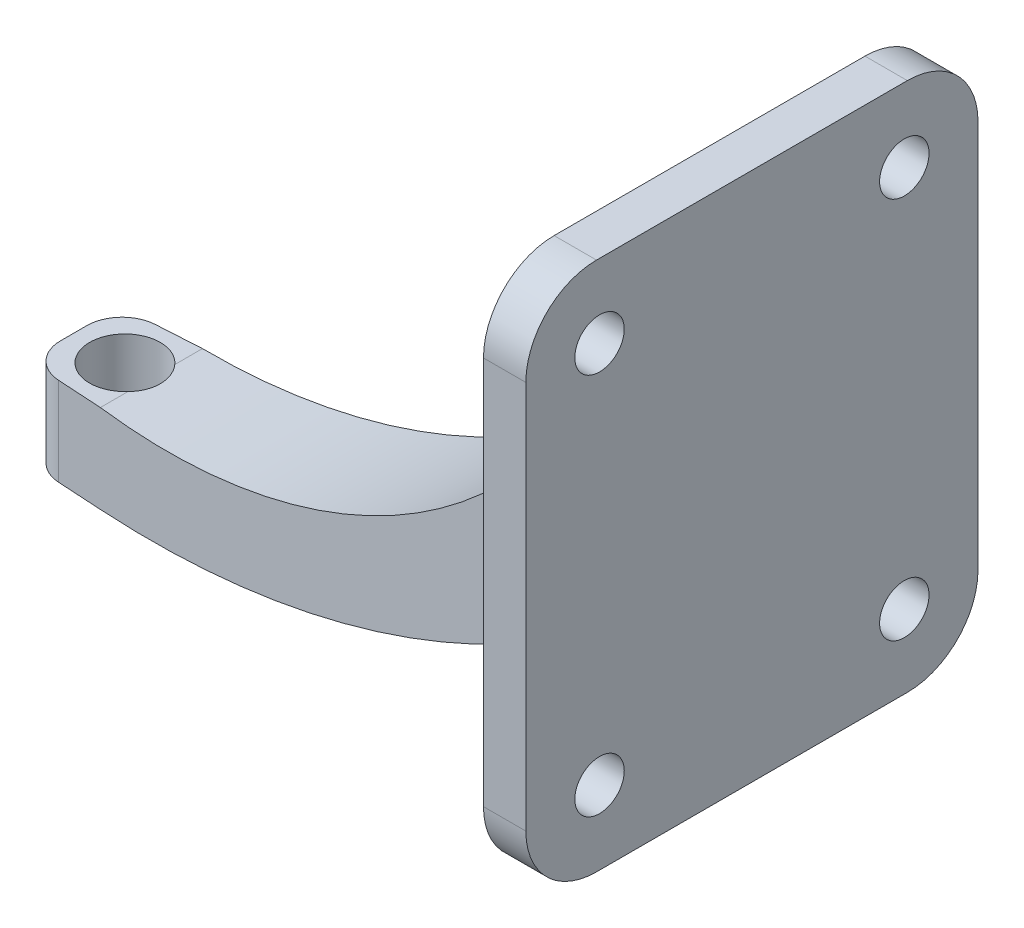
ISO-10303-21;
HEADER;
FILE_DESCRIPTION(('STEP AP214'),'2;1');
FILE_NAME('part.step','',(''),(''),'','','');
FILE_SCHEMA(('AUTOMOTIVE_DESIGN { 1 0 10303 214 1 1 1 1 }'));
ENDSEC;
DATA;
#1=APPLICATION_CONTEXT('core data for automotive mechanical design processes');
#2=APPLICATION_PROTOCOL_DEFINITION('international standard','automotive_design',2000,#1);
#3=PRODUCT_CONTEXT('',#1,'mechanical');
#4=PRODUCT('Part','Part','',(#3));
#5=PRODUCT_RELATED_PRODUCT_CATEGORY('part','',(#4));
#6=PRODUCT_DEFINITION_FORMATION('','',#4);
#7=PRODUCT_DEFINITION_CONTEXT('part definition',#1,'design');
#8=PRODUCT_DEFINITION('design','',#6,#7);
#9=PRODUCT_DEFINITION_SHAPE('','',#8);
#10=(LENGTH_UNIT() NAMED_UNIT(*) SI_UNIT(.MILLI.,.METRE.));
#11=(NAMED_UNIT(*) PLANE_ANGLE_UNIT() SI_UNIT($,.RADIAN.));
#12=(NAMED_UNIT(*) SI_UNIT($,.STERADIAN.) SOLID_ANGLE_UNIT());
#13=UNCERTAINTY_MEASURE_WITH_UNIT(LENGTH_MEASURE(1.E-05),#10,'distance_accuracy_value','');
#14=(GEOMETRIC_REPRESENTATION_CONTEXT(3) GLOBAL_UNCERTAINTY_ASSIGNED_CONTEXT((#13)) GLOBAL_UNIT_ASSIGNED_CONTEXT((#10,
#11,#12)) REPRESENTATION_CONTEXT('',''));
#15=CARTESIAN_POINT('',(0.,0.,0.));
#16=DIRECTION('',(0.,0.,1.));
#17=DIRECTION('',(1.,0.,0.));
#18=AXIS2_PLACEMENT_3D('',#15,#16,#17);
#19=CARTESIAN_POINT('',(22.,0.,48.));
#20=DIRECTION('',(0.,1.,0.));
#21=DIRECTION('',(-1.,0.,0.));
#22=AXIS2_PLACEMENT_3D('',#19,#20,#21);
#23=PLANE('',#22);
#24=DIRECTION('',(0.,0.,-1.));
#25=VECTOR('',#24,1.);
#26=CARTESIAN_POINT('',(21.9999999999999,0.,48.));
#27=LINE('',#26,#25);
#28=CARTESIAN_POINT('',(21.9999999999999,0.,17.3856217223384));
#29=VERTEX_POINT('',#28);
#30=CARTESIAN_POINT('',(22.,0.,9.55113868092659));
#31=VERTEX_POINT('',#30);
#32=EDGE_CURVE('E181',#29,#31,#27,.T.);
#33=ORIENTED_EDGE('',*,*,#32,.F.);
#34=CARTESIAN_POINT('',(14.5,0.,24.));
#35=DIRECTION('',(0.,1.,0.));
#36=DIRECTION('',(-1.,0.,0.));
#37=AXIS2_PLACEMENT_3D('',#34,#35,#36);
#38=CIRCLE('',#37,10.);
#39=CARTESIAN_POINT('',(22.,0.,30.6143782776615));
#40=VERTEX_POINT('',#39);
#41=EDGE_CURVE('E46',#29,#40,#38,.T.);
#42=ORIENTED_EDGE('',*,*,#41,.T.);
#43=CARTESIAN_POINT('',(22.,0.,38.4488613190734));
#44=VERTEX_POINT('',#43);
#45=EDGE_CURVE('E182',#44,#40,#27,.T.);
#46=ORIENTED_EDGE('',*,*,#45,.F.);
#47=DIRECTION('',(-0.998177876280131,0.,-0.06034009699104));
#48=VECTOR('',#47,1.);
#49=CARTESIAN_POINT('',(180.,0.,48.));
#50=LINE('',#49,#48);
#51=CARTESIAN_POINT('',(9.39659903008967,0.,37.6869826449282));
#52=VERTEX_POINT('',#51);
#53=EDGE_CURVE('E588',#44,#52,#50,.T.);
#54=ORIENTED_EDGE('',*,*,#53,.T.);
#55=CARTESIAN_POINT('',(10.,0.,27.7052038821269));
#56=DIRECTION('',(0.,-1.,0.));
#57=DIRECTION('',(0.,0.,-1.));
#58=AXIS2_PLACEMENT_3D('',#55,#56,#57);
#59=CIRCLE('',#58,10.);
#60=CARTESIAN_POINT('',(0.,0.,27.7052038821269));
#61=VERTEX_POINT('',#60);
#62=EDGE_CURVE('E602',#52,#61,#59,.T.);
#63=ORIENTED_EDGE('',*,*,#62,.T.);
#64=DIRECTION('',(0.,0.,-1.));
#65=VECTOR('',#64,1.);
#66=CARTESIAN_POINT('',(0.,0.,48.));
#67=LINE('',#66,#65);
#68=CARTESIAN_POINT('',(0.,0.,20.2947961178731));
#69=VERTEX_POINT('',#68);
#70=EDGE_CURVE('E266',#61,#69,#67,.T.);
#71=ORIENTED_EDGE('',*,*,#70,.T.);
#72=CARTESIAN_POINT('',(10.,0.,20.2947961178731));
#73=DIRECTION('',(0.,1.,0.));
#74=DIRECTION('',(0.,0.,1.));
#75=AXIS2_PLACEMENT_3D('',#72,#73,#74);
#76=CIRCLE('',#75,10.);
#77=CARTESIAN_POINT('',(9.39659903008966,0.,10.3130173550718));
#78=VERTEX_POINT('',#77);
#79=EDGE_CURVE('E604',#78,#69,#76,.T.);
#80=ORIENTED_EDGE('',*,*,#79,.F.);
#81=DIRECTION('',(-0.998177876280131,0.,0.06034009699104));
#82=VECTOR('',#81,1.);
#83=CARTESIAN_POINT('',(0.65536691487986,0.,10.8414269764296));
#84=LINE('',#83,#82);
#85=EDGE_CURVE('E611',#31,#78,#84,.T.);
#86=ORIENTED_EDGE('',*,*,#85,.F.);
#87=EDGE_LOOP('',(#33,#42,#46,#54,#63,#71,#80,#86));
#88=FACE_BOUND('',#87,.T.);
#89=ADVANCED_FACE('F32',(#88),#23,.F.);
#90=CARTESIAN_POINT('',(22.,250.800841383973,48.));
#91=DIRECTION('',(0.,0.,-1.));
#92=DIRECTION('',(-1.,0.,0.));
#93=AXIS2_PLACEMENT_3D('',#90,#91,#92);
#94=CYLINDRICAL_SURFACE('',#93,250.800841383973);
#95=ORIENTED_EDGE('',*,*,#45,.T.);
#96=CARTESIAN_POINT('',(22.,0.,30.6143782776615));
#97=CARTESIAN_POINT('',(22.186050208909,6.50438569303494E-07,30.403462890707));
#98=CARTESIAN_POINT('',(22.3631542831169,0.000207121473940263,30.1846637562066));
#99=CARTESIAN_POINT('',(22.6983088353976,0.000915985913102646,29.7329451696042));
#100=CARTESIAN_POINT('',(22.8563602372151,0.0014183649632125,29.5000264028983));
#101=CARTESIAN_POINT('',(23.1521655513058,0.00260294530021276,29.0218579567898));
#102=CARTESIAN_POINT('',(23.2899332240548,0.00328502379465494,28.7766167898009));
#103=CARTESIAN_POINT('',(23.5443271556839,0.00472242142916432,28.2754082161284));
#104=CARTESIAN_POINT('',(23.6609536685541,0.00547773968916116,28.0194409383538));
#105=CARTESIAN_POINT('',(23.8722881388576,0.00696634985879363,27.4984675560009));
#106=CARTESIAN_POINT('',(23.966985432651,0.007699630902084,27.2334571255245));
#107=CARTESIAN_POINT('',(24.133717752448,0.00906272072908062,26.6963942920705));
#108=CARTESIAN_POINT('',(24.2057523009994,0.0096925273326832,26.4243417408622));
#109=CARTESIAN_POINT('',(24.3266271850861,0.010784759559879,25.8752107495151));
#110=CARTESIAN_POINT('',(24.3754739529584,0.0112472315939436,25.5981337253434));
#111=CARTESIAN_POINT('',(24.4496554811822,0.0119608371465064,25.0408514810525));
#112=CARTESIAN_POINT('',(24.4749903956433,0.0122119720502238,24.7606462814492));
#113=CARTESIAN_POINT('',(24.5019670266176,0.0124796465290637,24.1991308542838));
#114=CARTESIAN_POINT('',(24.5036115497925,0.0124962138940035,23.9178207615712));
#115=CARTESIAN_POINT('',(24.4832029308705,0.0122933093696379,23.3560615375291));
#116=CARTESIAN_POINT('',(24.4611497817679,0.0120738374105529,23.0756124064541));
#117=CARTESIAN_POINT('',(24.3934849298324,0.0114189366233619,22.5174225978719));
#118=CARTESIAN_POINT('',(24.347860959702,0.0109833953479264,22.2396834075021));
#119=CARTESIAN_POINT('',(24.2333739091758,0.00993773723118055,21.6890463963613));
#120=CARTESIAN_POINT('',(24.1645115786116,0.00932762602281128,21.4161484196779));
#121=CARTESIAN_POINT('',(24.0039888971629,0.00799358405566048,20.8769619247376));
#122=CARTESIAN_POINT('',(23.9123147007484,0.00726958427139342,20.6106775289037));
#123=CARTESIAN_POINT('',(23.7068432988256,0.00578706559045944,20.0867917188718));
#124=CARTESIAN_POINT('',(23.5930467134783,0.0050285476619025,19.8291900615065));
#125=CARTESIAN_POINT('',(23.3443236906342,0.00357212006721676,19.3248649286816));
#126=CARTESIAN_POINT('',(23.2094276533276,0.0028741254136585,19.0781264469765));
#127=CARTESIAN_POINT('',(22.9193959393124,0.00164331384221562,18.5969811866283));
#128=CARTESIAN_POINT('',(22.7642706758823,0.00111041241346239,18.3625681498121));
#129=CARTESIAN_POINT('',(22.5056577230138,0.000492163892410827,18.0054092653159));
#130=CARTESIAN_POINT('',(22.4086125417838,0.000312897280832792,17.8779499218273));
#131=CARTESIAN_POINT('',(22.2086691591784,6.6922683868914E-05,17.6280310155925));
#132=CARTESIAN_POINT('',(22.1057802433741,4.10229845074396E-08,17.5055640241956));
#133=CARTESIAN_POINT('',(22.,0.,17.3856217223385));
#134=B_SPLINE_CURVE_WITH_KNOTS('',3,(#96,#97,#98,#99,#100,#101,#102,#103,#104,#105,#106,#107,
#108,#109,#110,#111,#112,#113,#114,#115,#116,#117,#118,#119,#120,#121,#122,#123,#124,#125,#126,
#127,#128,#129,#130,#131,#132,#133),.UNSPECIFIED.,.F.,.F.,(4,2,2,2,2,2,2,2,2,2,2,2,2,2,2,2,2,2,
4),(0.,0.843483743662568,1.68692657562449,2.52979455331877,3.37265240412073,4.21591925931614,
5.05920387902877,5.90225443299396,6.74529946110161,7.58824461066936,8.43119000943406,
9.27457455686237,10.1179318934206,10.9618023547167,11.8056491630463,12.6482911662237,
13.4905011072953,13.9709318345737,14.4506194370631),.UNSPECIFIED.);
#135=EDGE_CURVE('E164',#40,#29,#134,.T.);
#136=ORIENTED_EDGE('',*,*,#135,.T.);
#137=ORIENTED_EDGE('',*,*,#32,.T.);
#138=CARTESIAN_POINT('',(22.,250.800841383973,9.55113868092659));
#139=DIRECTION('',(0.06034009699104,0.,0.998177876280131));
#140=DIRECTION('',(0.998177876280131,0.,-0.06034009699104));
#141=AXIS2_PLACEMENT_3D('',#138,#139,#140);
#142=ELLIPSE('',#141,251.258665758674,250.800841383973);
#143=CARTESIAN_POINT('',(180.,56.0264538508357,0.));
#144=VERTEX_POINT('',#143);
#145=EDGE_CURVE('E293',#31,#144,#142,.T.);
#146=ORIENTED_EDGE('',*,*,#145,.T.);
#147=DIRECTION('',(0.,0.,-1.));
#148=VECTOR('',#147,1.);
#149=CARTESIAN_POINT('',(180.,56.0264538508357,48.));
#150=LINE('',#149,#148);
#151=CARTESIAN_POINT('',(180.,56.0264538508357,48.));
#152=VERTEX_POINT('',#151);
#153=EDGE_CURVE('E173',#152,#144,#150,.T.);
#154=ORIENTED_EDGE('',*,*,#153,.F.);
#155=CARTESIAN_POINT('',(22.,250.800841383973,38.4488613190734));
#156=DIRECTION('',(-0.06034009699104,0.,0.998177876280131));
#157=DIRECTION('',(-0.998177876280131,0.,-0.06034009699104));
#158=AXIS2_PLACEMENT_3D('',#155,#156,#157);
#159=ELLIPSE('',#158,251.258665758674,250.800841383973);
#160=EDGE_CURVE('E584',#44,#152,#159,.T.);
#161=ORIENTED_EDGE('',*,*,#160,.F.);
#162=EDGE_LOOP('',(#95,#136,#137,#146,#154,#161));
#163=FACE_BOUND('',#162,.T.);
#164=ADVANCED_FACE('F334',(#163),#94,.T.);
#165=CARTESIAN_POINT('',(32.8247771228576,179.652695744579,48.));
#166=DIRECTION('',(0.,0.,-1.));
#167=DIRECTION('',(-1.,0.,0.));
#168=AXIS2_PLACEMENT_3D('',#165,#166,#167);
#169=CYLINDRICAL_SURFACE('',#168,155.030670223036);
#170=DIRECTION('',(0.,0.,-1.));
#171=VECTOR('',#170,1.);
#172=CARTESIAN_POINT('',(22.,25.0003989299366,48.));
#173=LINE('',#172,#171);
#174=CARTESIAN_POINT('',(22.,25.0003989299366,17.3856217223385));
#175=VERTEX_POINT('',#174);
#176=CARTESIAN_POINT('',(22.,25.0003989299366,9.55113868092659));
#177=VERTEX_POINT('',#176);
#178=EDGE_CURVE('E163',#175,#177,#173,.T.);
#179=ORIENTED_EDGE('',*,*,#178,.F.);
#180=CARTESIAN_POINT('',(22.0000000000001,25.0003989299366,17.3856217223386));
#181=CARTESIAN_POINT('',(22.1855939760026,24.987409433937,17.5960187259061));
#182=CARTESIAN_POINT('',(22.3623139527442,24.9753749044858,17.8142954204005));
#183=CARTESIAN_POINT('',(22.6968290239547,24.953110848166,18.2649694147809));
#184=CARTESIAN_POINT('',(22.854625007243,24.9428812365137,18.4973660507105));
#185=CARTESIAN_POINT('',(23.1500310486237,24.9241273484724,18.9744967732383));
#186=CARTESIAN_POINT('',(23.2876549422224,24.9156019017676,19.2192222475433));
#187=CARTESIAN_POINT('',(23.5418612288987,24.9001435471583,19.7194117900843));
#188=CARTESIAN_POINT('',(23.6584438900982,24.8932106189604,19.9748757214322));
#189=CARTESIAN_POINT('',(23.8697813072919,24.8808379132245,20.4948606007756));
#190=CARTESIAN_POINT('',(23.9645252502854,24.8753988751018,20.7593859612228));
#191=CARTESIAN_POINT('',(24.1314322731875,24.8659344914342,21.2954978698768));
#192=CARTESIAN_POINT('',(24.2035948745347,24.8619091758499,21.5670845676008));
#193=CARTESIAN_POINT('',(24.3248013078037,24.8552060724568,22.115307002797));
#194=CARTESIAN_POINT('',(24.3738514596554,24.8525279162636,22.3919413385135));
#195=CARTESIAN_POINT('',(24.4485101192727,24.8484701509459,22.9483629205716));
#196=CARTESIAN_POINT('',(24.4741187832512,24.8470905331678,23.2281501458897));
#197=CARTESIAN_POINT('',(24.5017087189152,24.84560471164,23.7888363208336));
#198=CARTESIAN_POINT('',(24.50369454943,24.845498262189,24.0697350454904));
#199=CARTESIAN_POINT('',(24.4840363831908,24.8465561707056,24.6307020788471));
#200=CARTESIAN_POINT('',(24.4623923810937,24.8477205289605,24.9107703873593));
#201=CARTESIAN_POINT('',(24.3956126022506,24.8513423544826,25.4682290035703));
#202=CARTESIAN_POINT('',(24.3504648285393,24.8538004821319,25.7456178698912));
#203=CARTESIAN_POINT('',(24.2369963646298,24.8600539458768,26.2955903660448));
#204=CARTESIAN_POINT('',(24.1686764133724,24.8638492393315,26.5681741488159));
#205=CARTESIAN_POINT('',(24.0093037290359,24.8728439976247,27.1067776298998));
#206=CARTESIAN_POINT('',(23.9182365576635,24.8780443544681,27.3727930407914));
#207=CARTESIAN_POINT('',(23.7140480494721,24.8899296323726,27.8961800860659));
#208=CARTESIAN_POINT('',(23.6009273260831,24.8966145121419,28.1535519606394));
#209=CARTESIAN_POINT('',(23.3536256318566,24.9115528115728,28.6574654724933));
#210=CARTESIAN_POINT('',(23.219474405915,24.9198040192929,28.9040217860207));
#211=CARTESIAN_POINT('',(22.9310125103265,24.9379808988558,29.3848459155078));
#212=CARTESIAN_POINT('',(22.7767120896335,24.9479057201522,29.6191198945817));
#213=CARTESIAN_POINT('',(22.5170303432329,24.9650482302927,29.9794762321919));
#214=CARTESIAN_POINT('',(22.4178986071571,24.971681710177,30.1101357458512));
#215=CARTESIAN_POINT('',(22.2135109447922,24.9855686288442,30.3662032797464));
#216=CARTESIAN_POINT('',(22.108264869055,24.9928210788146,30.4916192161617));
#217=CARTESIAN_POINT('',(22.0000000000001,25.0003989299366,30.6143782776614));
#218=B_SPLINE_CURVE_WITH_KNOTS('',3,(#180,#181,#182,#183,#184,#185,#186,#187,#188,#189,#190,
#191,#192,#193,#194,#195,#196,#197,#198,#199,#200,#201,#202,#203,#204,#205,#206,#207,#208,#209,
#210,#211,#212,#213,#214,#215,#216,#217),.UNSPECIFIED.,.F.,.F.,(4,2,2,2,2,2,2,2,2,2,2,2,2,2,2,2,
2,2,4),(0.,0.842314855920561,1.68459013460727,2.52628498806316,3.36796911530456,
4.21006909453971,5.05218691900215,5.89407433869965,6.7359561480652,7.57767548505747,
8.41939501237567,9.26154459812594,10.1036673309734,10.9463259468795,11.7889611271787,
12.6304150875359,13.4714426947358,13.9636923736755,14.4551698919433),.UNSPECIFIED.);
#219=CARTESIAN_POINT('',(22.,25.0003989299366,30.6143782776615));
#220=VERTEX_POINT('',#219);
#221=EDGE_CURVE('E53',#175,#220,#218,.T.);
#222=ORIENTED_EDGE('',*,*,#221,.T.);
#223=CARTESIAN_POINT('',(22.,25.0003989299366,38.4488613190734));
#224=VERTEX_POINT('',#223);
#225=EDGE_CURVE('E161',#224,#220,#173,.T.);
#226=ORIENTED_EDGE('',*,*,#225,.F.);
#227=CARTESIAN_POINT('',(32.8247771228576,179.652695744579,39.1032217462287));
#228=DIRECTION('',(-0.06034009699104,0.,0.998177876280131));
#229=DIRECTION('',(-0.998177876280131,0.,-0.06034009699104));
#230=AXIS2_PLACEMENT_3D('',#227,#228,#229);
#231=ELLIPSE('',#230,155.313670946888,155.030670223036);
#232=CARTESIAN_POINT('',(180.,130.929369905027,48.));
#233=VERTEX_POINT('',#232);
#234=EDGE_CURVE('E590',#233,#224,#231,.F.);
#235=ORIENTED_EDGE('',*,*,#234,.F.);
#236=DIRECTION('',(0.,0.,-1.));
#237=VECTOR('',#236,1.);
#238=CARTESIAN_POINT('',(180.,130.929369905027,48.));
#239=LINE('',#238,#237);
#240=CARTESIAN_POINT('',(180.,130.929369905027,0.));
#241=VERTEX_POINT('',#240);
#242=EDGE_CURVE('E170',#233,#241,#239,.T.);
#243=ORIENTED_EDGE('',*,*,#242,.T.);
#244=CARTESIAN_POINT('',(32.8247771228576,179.652695744579,8.89677825377131));
#245=DIRECTION('',(0.06034009699104,0.,0.998177876280131));
#246=DIRECTION('',(0.998177876280131,0.,-0.06034009699104));
#247=AXIS2_PLACEMENT_3D('',#244,#245,#246);
#248=ELLIPSE('',#247,155.313670946888,155.030670223036);
#249=EDGE_CURVE('E595',#241,#177,#248,.F.);
#250=ORIENTED_EDGE('',*,*,#249,.T.);
#251=EDGE_LOOP('',(#179,#222,#226,#235,#243,#250));
#252=FACE_BOUND('',#251,.T.);
#253=ADVANCED_FACE('F159',(#252),#169,.F.);
#254=CARTESIAN_POINT('',(0.,25.0003989299366,48.));
#255=DIRECTION('',(0.,-1.,0.));
#256=DIRECTION('',(1.,0.,0.));
#257=AXIS2_PLACEMENT_3D('',#254,#255,#256);
#258=PLANE('',#257);
#259=ORIENTED_EDGE('',*,*,#225,.T.);
#260=CARTESIAN_POINT('',(14.5,25.0003989299366,24.));
#261=DIRECTION('',(0.,-1.,0.));
#262=DIRECTION('',(1.,0.,0.));
#263=AXIS2_PLACEMENT_3D('',#260,#261,#262);
#264=CIRCLE('',#263,10.);
#265=EDGE_CURVE('E11',#220,#175,#264,.T.);
#266=ORIENTED_EDGE('',*,*,#265,.T.);
#267=ORIENTED_EDGE('',*,*,#178,.T.);
#268=DIRECTION('',(-0.998177876280131,0.,0.06034009699104));
#269=VECTOR('',#268,1.);
#270=CARTESIAN_POINT('',(-2.2356802788347,25.0003989299366,11.0161914870642));
#271=LINE('',#270,#269);
#272=CARTESIAN_POINT('',(9.39659903008966,25.0003989299366,10.3130173550718));
#273=VERTEX_POINT('',#272);
#274=EDGE_CURVE('E286',#177,#273,#271,.T.);
#275=ORIENTED_EDGE('',*,*,#274,.T.);
#276=CARTESIAN_POINT('',(10.,25.0003989299366,20.2947961178731));
#277=DIRECTION('',(0.,-1.,0.));
#278=DIRECTION('',(1.,0.,0.));
#279=AXIS2_PLACEMENT_3D('',#276,#277,#278);
#280=CIRCLE('',#279,10.);
#281=CARTESIAN_POINT('',(0.,25.0003989299366,20.2947961178731));
#282=VERTEX_POINT('',#281);
#283=EDGE_CURVE('E284',#273,#282,#280,.F.);
#284=ORIENTED_EDGE('',*,*,#283,.T.);
#285=DIRECTION('',(0.,0.,-1.));
#286=VECTOR('',#285,1.);
#287=CARTESIAN_POINT('',(0.,25.0003989299366,48.));
#288=LINE('',#287,#286);
#289=CARTESIAN_POINT('',(0.,25.0003989299366,27.7052038821269));
#290=VERTEX_POINT('',#289);
#291=EDGE_CURVE('E175',#290,#282,#288,.T.);
#292=ORIENTED_EDGE('',*,*,#291,.F.);
#293=CARTESIAN_POINT('',(10.,25.0003989299366,27.7052038821269));
#294=DIRECTION('',(0.,-1.,0.));
#295=DIRECTION('',(1.,0.,0.));
#296=AXIS2_PLACEMENT_3D('',#293,#294,#295);
#297=CIRCLE('',#296,10.);
#298=CARTESIAN_POINT('',(9.39659903008967,25.0003989299366,37.6869826449282));
#299=VERTEX_POINT('',#298);
#300=EDGE_CURVE('E282',#299,#290,#297,.T.);
#301=ORIENTED_EDGE('',*,*,#300,.F.);
#302=DIRECTION('',(-0.998177876280131,0.,-0.06034009699104));
#303=VECTOR('',#302,1.);
#304=CARTESIAN_POINT('',(0.65536691487986,25.0003989299366,37.1585730235704));
#305=LINE('',#304,#303);
#306=EDGE_CURVE('E169',#224,#299,#305,.T.);
#307=ORIENTED_EDGE('',*,*,#306,.F.);
#308=EDGE_LOOP('',(#259,#266,#267,#275,#284,#292,#301,#307));
#309=FACE_BOUND('',#308,.T.);
#310=ADVANCED_FACE('F167',(#309),#258,.F.);
#311=CARTESIAN_POINT('',(0.,0.,48.));
#312=DIRECTION('',(1.,0.,0.));
#313=DIRECTION('',(0.,0.,-1.));
#314=AXIS2_PLACEMENT_3D('',#311,#312,#313);
#315=PLANE('',#314);
#316=DIRECTION('',(0.,-1.,0.));
#317=VECTOR('',#316,1.);
#318=CARTESIAN_POINT('',(0.,180.,20.2947961178731));
#319=LINE('',#318,#317);
#320=EDGE_CURVE('E279',#282,#69,#319,.T.);
#321=ORIENTED_EDGE('',*,*,#320,.T.);
#322=ORIENTED_EDGE('',*,*,#70,.F.);
#323=DIRECTION('',(0.,-1.,0.));
#324=VECTOR('',#323,1.);
#325=CARTESIAN_POINT('',(0.,180.,27.7052038821269));
#326=LINE('',#325,#324);
#327=EDGE_CURVE('E280',#290,#61,#326,.T.);
#328=ORIENTED_EDGE('',*,*,#327,.F.);
#329=ORIENTED_EDGE('',*,*,#291,.T.);
#330=EDGE_LOOP('',(#321,#322,#328,#329));
#331=FACE_BOUND('',#330,.T.);
#332=ADVANCED_FACE('F278',(#331),#315,.F.);
#333=CARTESIAN_POINT('',(180.,130.929369905027,-40.));
#334=DIRECTION('',(-1.,0.,0.));
#335=DIRECTION('',(0.,0.,1.));
#336=AXIS2_PLACEMENT_3D('',#333,#334,#335);
#337=PLANE('',#336);
#338=ORIENTED_EDGE('',*,*,#153,.T.);
#339=DIRECTION('',(0.,1.,0.));
#340=VECTOR('',#339,1.);
#341=CARTESIAN_POINT('',(180.,130.929369905027,0.));
#342=LINE('',#341,#340);
#343=EDGE_CURVE('E256',#144,#241,#342,.T.);
#344=ORIENTED_EDGE('',*,*,#343,.T.);
#345=ORIENTED_EDGE('',*,*,#242,.F.);
#346=DIRECTION('',(0.,1.,0.));
#347=VECTOR('',#346,1.);
#348=CARTESIAN_POINT('',(180.,130.929369905027,48.));
#349=LINE('',#348,#347);
#350=EDGE_CURVE('E264',#152,#233,#349,.T.);
#351=ORIENTED_EDGE('',*,*,#350,.F.);
#352=EDGE_LOOP('',(#338,#344,#345,#351));
#353=FACE_BOUND('',#352,.T.);
#354=DIRECTION('',(0.,0.,1.));
#355=VECTOR('',#354,1.);
#356=CARTESIAN_POINT('',(180.,10.9293699050267,-40.));
#357=LINE('',#356,#355);
#358=CARTESIAN_POINT('',(180.,10.9293699050267,-20.));
#359=VERTEX_POINT('',#358);
#360=CARTESIAN_POINT('',(180.,10.9293699050267,68.));
#361=VERTEX_POINT('',#360);
#362=EDGE_CURVE('E253',#359,#361,#357,.T.);
#363=ORIENTED_EDGE('',*,*,#362,.T.);
#364=CARTESIAN_POINT('',(180.,30.9293699050267,68.));
#365=DIRECTION('',(-1.,0.,0.));
#366=DIRECTION('',(0.,0.,1.));
#367=AXIS2_PLACEMENT_3D('',#364,#365,#366);
#368=CIRCLE('',#367,20.);
#369=CARTESIAN_POINT('',(180.,30.9293699050267,88.));
#370=VERTEX_POINT('',#369);
#371=EDGE_CURVE('E195',#361,#370,#368,.T.);
#372=ORIENTED_EDGE('',*,*,#371,.T.);
#373=DIRECTION('',(0.,-1.,0.));
#374=VECTOR('',#373,1.);
#375=CARTESIAN_POINT('',(180.,51.3088314213964,88.));
#376=LINE('',#375,#374);
#377=CARTESIAN_POINT('',(180.,140.929369905027,88.));
#378=VERTEX_POINT('',#377);
#379=EDGE_CURVE('E233',#378,#370,#376,.T.);
#380=ORIENTED_EDGE('',*,*,#379,.F.);
#381=CARTESIAN_POINT('',(180.,140.929369905027,68.));
#382=DIRECTION('',(-1.,0.,0.));
#383=DIRECTION('',(0.,0.,1.));
#384=AXIS2_PLACEMENT_3D('',#381,#382,#383);
#385=CIRCLE('',#384,20.);
#386=CARTESIAN_POINT('',(180.,160.929369905027,68.));
#387=VERTEX_POINT('',#386);
#388=EDGE_CURVE('E197',#378,#387,#385,.T.);
#389=ORIENTED_EDGE('',*,*,#388,.T.);
#390=DIRECTION('',(0.,0.,1.));
#391=VECTOR('',#390,1.);
#392=CARTESIAN_POINT('',(180.,160.929369905027,-40.));
#393=LINE('',#392,#391);
#394=CARTESIAN_POINT('',(180.,160.929369905027,-20.));
#395=VERTEX_POINT('',#394);
#396=EDGE_CURVE('E254',#395,#387,#393,.T.);
#397=ORIENTED_EDGE('',*,*,#396,.F.);
#398=CARTESIAN_POINT('',(180.,140.929369905027,-20.));
#399=DIRECTION('',(-1.,0.,0.));
#400=DIRECTION('',(0.,0.,1.));
#401=AXIS2_PLACEMENT_3D('',#398,#399,#400);
#402=CIRCLE('',#401,20.);
#403=CARTESIAN_POINT('',(180.,140.929369905027,-40.));
#404=VERTEX_POINT('',#403);
#405=EDGE_CURVE('E191',#395,#404,#402,.T.);
#406=ORIENTED_EDGE('',*,*,#405,.T.);
#407=DIRECTION('',(0.,-1.,0.));
#408=VECTOR('',#407,1.);
#409=CARTESIAN_POINT('',(180.,51.3088314213964,-40.));
#410=LINE('',#409,#408);
#411=CARTESIAN_POINT('',(180.,30.9293699050267,-40.));
#412=VERTEX_POINT('',#411);
#413=EDGE_CURVE('E243',#404,#412,#410,.T.);
#414=ORIENTED_EDGE('',*,*,#413,.T.);
#415=CARTESIAN_POINT('',(180.,30.9293699050267,-20.));
#416=DIRECTION('',(-1.,0.,0.));
#417=DIRECTION('',(0.,0.,1.));
#418=AXIS2_PLACEMENT_3D('',#415,#416,#417);
#419=CIRCLE('',#418,20.);
#420=EDGE_CURVE('E193',#412,#359,#419,.T.);
#421=ORIENTED_EDGE('',*,*,#420,.T.);
#422=EDGE_LOOP('',(#363,#372,#380,#389,#397,#406,#414,#421));
#423=FACE_BOUND('',#422,.T.);
#424=CARTESIAN_POINT('',(180.,31.7872342812958,67.1421356237309));
#425=DIRECTION('',(-1.,0.,0.));
#426=DIRECTION('',(0.,0.,1.));
#427=AXIS2_PLACEMENT_3D('',#424,#425,#426);
#428=CIRCLE('',#427,7.);
#429=CARTESIAN_POINT('',(180.,31.7872342812958,74.1421356237309));
#430=VERTEX_POINT('',#429);
#431=EDGE_CURVE('E292',#430,#430,#428,.T.);
#432=ORIENTED_EDGE('',*,*,#431,.F.);
#433=EDGE_LOOP('',(#432));
#434=FACE_BOUND('',#433,.T.);
#435=CARTESIAN_POINT('',(180.,140.071505528758,67.1421356237309));
#436=DIRECTION('',(-1.,0.,0.));
#437=DIRECTION('',(0.,0.,1.));
#438=AXIS2_PLACEMENT_3D('',#435,#436,#437);
#439=CIRCLE('',#438,7.);
#440=CARTESIAN_POINT('',(180.,140.071505528758,74.1421356237309));
#441=VERTEX_POINT('',#440);
#442=EDGE_CURVE('E297',#441,#441,#439,.T.);
#443=ORIENTED_EDGE('',*,*,#442,.F.);
#444=EDGE_LOOP('',(#443));
#445=FACE_BOUND('',#444,.T.);
#446=CARTESIAN_POINT('',(180.,140.071505528758,-19.1421356237309));
#447=DIRECTION('',(-1.,0.,0.));
#448=DIRECTION('',(0.,0.,1.));
#449=AXIS2_PLACEMENT_3D('',#446,#447,#448);
#450=CIRCLE('',#449,7.);
#451=CARTESIAN_POINT('',(180.,140.071505528758,-12.1421356237309));
#452=VERTEX_POINT('',#451);
#453=EDGE_CURVE('E226',#452,#452,#450,.T.);
#454=ORIENTED_EDGE('',*,*,#453,.F.);
#455=EDGE_LOOP('',(#454));
#456=FACE_BOUND('',#455,.T.);
#457=CARTESIAN_POINT('',(180.,31.7872342812958,-19.1421356237309));
#458=DIRECTION('',(-1.,0.,0.));
#459=DIRECTION('',(0.,0.,1.));
#460=AXIS2_PLACEMENT_3D('',#457,#458,#459);
#461=CIRCLE('',#460,7.);
#462=CARTESIAN_POINT('',(180.,31.7872342812958,-12.1421356237309));
#463=VERTEX_POINT('',#462);
#464=EDGE_CURVE('E289',#463,#463,#461,.T.);
#465=ORIENTED_EDGE('',*,*,#464,.F.);
#466=EDGE_LOOP('',(#465));
#467=FACE_BOUND('',#466,.T.);
#468=ADVANCED_FACE('F305',(#353,#423,#434,#445,#456,#467),#337,.T.);
#469=CARTESIAN_POINT('',(180.,160.929369905027,-40.));
#470=DIRECTION('',(0.,1.,0.));
#471=DIRECTION('',(0.,0.,1.));
#472=AXIS2_PLACEMENT_3D('',#469,#470,#471);
#473=PLANE('',#472);
#474=ORIENTED_EDGE('',*,*,#396,.T.);
#475=DIRECTION('',(-1.,0.,0.));
#476=VECTOR('',#475,1.);
#477=CARTESIAN_POINT('',(192.,160.929369905027,68.));
#478=LINE('',#477,#476);
#479=CARTESIAN_POINT('',(192.,160.929369905027,68.));
#480=VERTEX_POINT('',#479);
#481=EDGE_CURVE('E203',#387,#480,#478,.F.);
#482=ORIENTED_EDGE('',*,*,#481,.T.);
#483=DIRECTION('',(0.,0.,1.));
#484=VECTOR('',#483,1.);
#485=CARTESIAN_POINT('',(192.,160.929369905027,-40.));
#486=LINE('',#485,#484);
#487=CARTESIAN_POINT('',(192.,160.929369905027,-20.));
#488=VERTEX_POINT('',#487);
#489=EDGE_CURVE('E257',#488,#480,#486,.T.);
#490=ORIENTED_EDGE('',*,*,#489,.F.);
#491=DIRECTION('',(-1.,0.,0.));
#492=VECTOR('',#491,1.);
#493=CARTESIAN_POINT('',(180.,160.929369905027,-20.));
#494=LINE('',#493,#492);
#495=EDGE_CURVE('E200',#488,#395,#494,.T.);
#496=ORIENTED_EDGE('',*,*,#495,.T.);
#497=EDGE_LOOP('',(#474,#482,#490,#496));
#498=FACE_BOUND('',#497,.T.);
#499=ADVANCED_FACE('F308',(#498),#473,.T.);
#500=CARTESIAN_POINT('',(192.,160.929369905027,-40.));
#501=DIRECTION('',(1.,0.,0.));
#502=DIRECTION('',(0.,0.,-1.));
#503=AXIS2_PLACEMENT_3D('',#500,#501,#502);
#504=PLANE('',#503);
#505=CARTESIAN_POINT('',(192.,31.7872342812958,-19.1421356237309));
#506=DIRECTION('',(1.,0.,0.));
#507=DIRECTION('',(0.,0.,-1.));
#508=AXIS2_PLACEMENT_3D('',#505,#506,#507);
#509=CIRCLE('',#508,7.);
#510=CARTESIAN_POINT('',(192.,31.7872342812958,-26.1421356237309));
#511=VERTEX_POINT('',#510);
#512=EDGE_CURVE('E231',#511,#511,#509,.T.);
#513=ORIENTED_EDGE('',*,*,#512,.F.);
#514=EDGE_LOOP('',(#513));
#515=FACE_BOUND('',#514,.T.);
#516=CARTESIAN_POINT('',(192.,31.7872342812958,67.1421356237309));
#517=DIRECTION('',(1.,0.,0.));
#518=DIRECTION('',(0.,0.,-1.));
#519=AXIS2_PLACEMENT_3D('',#516,#517,#518);
#520=CIRCLE('',#519,7.);
#521=CARTESIAN_POINT('',(192.,31.7872342812958,60.1421356237309));
#522=VERTEX_POINT('',#521);
#523=EDGE_CURVE('E229',#522,#522,#520,.T.);
#524=ORIENTED_EDGE('',*,*,#523,.F.);
#525=EDGE_LOOP('',(#524));
#526=FACE_BOUND('',#525,.T.);
#527=CARTESIAN_POINT('',(192.,140.071505528758,67.1421356237309));
#528=DIRECTION('',(1.,0.,0.));
#529=DIRECTION('',(0.,0.,-1.));
#530=AXIS2_PLACEMENT_3D('',#527,#528,#529);
#531=CIRCLE('',#530,7.);
#532=CARTESIAN_POINT('',(192.,140.071505528758,60.1421356237309));
#533=VERTEX_POINT('',#532);
#534=EDGE_CURVE('E225',#533,#533,#531,.T.);
#535=ORIENTED_EDGE('',*,*,#534,.F.);
#536=EDGE_LOOP('',(#535));
#537=FACE_BOUND('',#536,.T.);
#538=CARTESIAN_POINT('',(192.,140.071505528758,-19.1421356237309));
#539=DIRECTION('',(1.,0.,0.));
#540=DIRECTION('',(0.,0.,-1.));
#541=AXIS2_PLACEMENT_3D('',#538,#539,#540);
#542=CIRCLE('',#541,7.);
#543=CARTESIAN_POINT('',(192.,140.071505528758,-26.1421356237309));
#544=VERTEX_POINT('',#543);
#545=EDGE_CURVE('E222',#544,#544,#542,.T.);
#546=ORIENTED_EDGE('',*,*,#545,.F.);
#547=EDGE_LOOP('',(#546));
#548=FACE_BOUND('',#547,.T.);
#549=ORIENTED_EDGE('',*,*,#489,.T.);
#550=CARTESIAN_POINT('',(192.,140.929369905027,68.));
#551=DIRECTION('',(1.,0.,0.));
#552=DIRECTION('',(0.,0.,-1.));
#553=AXIS2_PLACEMENT_3D('',#550,#551,#552);
#554=CIRCLE('',#553,20.);
#555=CARTESIAN_POINT('',(192.,140.929369905027,88.));
#556=VERTEX_POINT('',#555);
#557=EDGE_CURVE('E211',#480,#556,#554,.T.);
#558=ORIENTED_EDGE('',*,*,#557,.T.);
#559=DIRECTION('',(0.,1.,0.));
#560=VECTOR('',#559,1.);
#561=CARTESIAN_POINT('',(192.,160.929369905027,88.));
#562=LINE('',#561,#560);
#563=CARTESIAN_POINT('',(192.,30.9293699050267,88.));
#564=VERTEX_POINT('',#563);
#565=EDGE_CURVE('E237',#564,#556,#562,.T.);
#566=ORIENTED_EDGE('',*,*,#565,.F.);
#567=CARTESIAN_POINT('',(192.,30.9293699050267,68.));
#568=DIRECTION('',(1.,0.,0.));
#569=DIRECTION('',(0.,0.,-1.));
#570=AXIS2_PLACEMENT_3D('',#567,#568,#569);
#571=CIRCLE('',#570,20.);
#572=CARTESIAN_POINT('',(192.,10.9293699050267,68.));
#573=VERTEX_POINT('',#572);
#574=EDGE_CURVE('E209',#564,#573,#571,.T.);
#575=ORIENTED_EDGE('',*,*,#574,.T.);
#576=DIRECTION('',(0.,0.,1.));
#577=VECTOR('',#576,1.);
#578=CARTESIAN_POINT('',(192.,10.9293699050267,-40.));
#579=LINE('',#578,#577);
#580=CARTESIAN_POINT('',(192.,10.9293699050267,-20.));
#581=VERTEX_POINT('',#580);
#582=EDGE_CURVE('E260',#581,#573,#579,.T.);
#583=ORIENTED_EDGE('',*,*,#582,.F.);
#584=CARTESIAN_POINT('',(192.,30.9293699050267,-20.));
#585=DIRECTION('',(1.,0.,0.));
#586=DIRECTION('',(0.,0.,-1.));
#587=AXIS2_PLACEMENT_3D('',#584,#585,#586);
#588=CIRCLE('',#587,20.);
#589=CARTESIAN_POINT('',(192.,30.9293699050267,-40.));
#590=VERTEX_POINT('',#589);
#591=EDGE_CURVE('E207',#581,#590,#588,.T.);
#592=ORIENTED_EDGE('',*,*,#591,.T.);
#593=DIRECTION('',(0.,1.,0.));
#594=VECTOR('',#593,1.);
#595=CARTESIAN_POINT('',(192.,160.929369905027,-40.));
#596=LINE('',#595,#594);
#597=CARTESIAN_POINT('',(192.,140.929369905027,-40.));
#598=VERTEX_POINT('',#597);
#599=EDGE_CURVE('E250',#590,#598,#596,.T.);
#600=ORIENTED_EDGE('',*,*,#599,.T.);
#601=CARTESIAN_POINT('',(192.,140.929369905027,-20.));
#602=DIRECTION('',(1.,0.,0.));
#603=DIRECTION('',(0.,0.,-1.));
#604=AXIS2_PLACEMENT_3D('',#601,#602,#603);
#605=CIRCLE('',#604,20.);
#606=EDGE_CURVE('E205',#598,#488,#605,.T.);
#607=ORIENTED_EDGE('',*,*,#606,.T.);
#608=EDGE_LOOP('',(#549,#558,#566,#575,#583,#592,#600,#607));
#609=FACE_BOUND('',#608,.T.);
#610=ADVANCED_FACE('F380',(#515,#526,#537,#548,#609),#504,.T.);
#611=CARTESIAN_POINT('',(192.,10.9293699050267,-40.));
#612=DIRECTION('',(0.,-1.,0.));
#613=DIRECTION('',(0.,0.,-1.));
#614=AXIS2_PLACEMENT_3D('',#611,#612,#613);
#615=PLANE('',#614);
#616=ORIENTED_EDGE('',*,*,#582,.T.);
#617=DIRECTION('',(1.,0.,0.));
#618=VECTOR('',#617,1.);
#619=CARTESIAN_POINT('',(180.,10.9293699050267,68.));
#620=LINE('',#619,#618);
#621=EDGE_CURVE('E216',#573,#361,#620,.F.);
#622=ORIENTED_EDGE('',*,*,#621,.T.);
#623=ORIENTED_EDGE('',*,*,#362,.F.);
#624=DIRECTION('',(1.,0.,0.));
#625=VECTOR('',#624,1.);
#626=CARTESIAN_POINT('',(192.,10.9293699050267,-20.));
#627=LINE('',#626,#625);
#628=EDGE_CURVE('E213',#359,#581,#627,.T.);
#629=ORIENTED_EDGE('',*,*,#628,.T.);
#630=EDGE_LOOP('',(#616,#622,#623,#629));
#631=FACE_BOUND('',#630,.T.);
#632=ADVANCED_FACE('F368',(#631),#615,.T.);
#633=CARTESIAN_POINT('',(0.,0.,-40.));
#634=DIRECTION('',(0.,0.,-1.));
#635=DIRECTION('',(-1.,0.,0.));
#636=AXIS2_PLACEMENT_3D('',#633,#634,#635);
#637=PLANE('',#636);
#638=ORIENTED_EDGE('',*,*,#599,.F.);
#639=DIRECTION('',(1.,0.,0.));
#640=VECTOR('',#639,1.);
#641=CARTESIAN_POINT('',(0.,30.9293699050267,-40.));
#642=LINE('',#641,#640);
#643=EDGE_CURVE('E40',#590,#412,#642,.F.);
#644=ORIENTED_EDGE('',*,*,#643,.T.);
#645=ORIENTED_EDGE('',*,*,#413,.F.);
#646=DIRECTION('',(-1.,0.,0.));
#647=VECTOR('',#646,1.);
#648=CARTESIAN_POINT('',(0.,140.929369905027,-40.));
#649=LINE('',#648,#647);
#650=EDGE_CURVE('E219',#404,#598,#649,.F.);
#651=ORIENTED_EDGE('',*,*,#650,.T.);
#652=EDGE_LOOP('',(#638,#644,#645,#651));
#653=FACE_BOUND('',#652,.T.);
#654=ADVANCED_FACE('F386',(#653),#637,.T.);
#655=CARTESIAN_POINT('',(0.,0.,88.));
#656=DIRECTION('',(0.,0.,-1.));
#657=DIRECTION('',(-1.,0.,0.));
#658=AXIS2_PLACEMENT_3D('',#655,#656,#657);
#659=PLANE('',#658);
#660=ORIENTED_EDGE('',*,*,#565,.T.);
#661=DIRECTION('',(-1.,0.,0.));
#662=VECTOR('',#661,1.);
#663=CARTESIAN_POINT('',(180.,140.929369905027,88.));
#664=LINE('',#663,#662);
#665=EDGE_CURVE('E188',#556,#378,#664,.T.);
#666=ORIENTED_EDGE('',*,*,#665,.T.);
#667=ORIENTED_EDGE('',*,*,#379,.T.);
#668=DIRECTION('',(1.,0.,0.));
#669=VECTOR('',#668,1.);
#670=CARTESIAN_POINT('',(192.,30.9293699050267,88.));
#671=LINE('',#670,#669);
#672=EDGE_CURVE('E185',#370,#564,#671,.T.);
#673=ORIENTED_EDGE('',*,*,#672,.T.);
#674=EDGE_LOOP('',(#660,#666,#667,#673));
#675=FACE_BOUND('',#674,.T.);
#676=ADVANCED_FACE('F349',(#675),#659,.F.);
#677=CARTESIAN_POINT('',(0.,140.929369905027,68.));
#678=DIRECTION('',(1.,0.,0.));
#679=DIRECTION('',(0.,0.,-1.));
#680=AXIS2_PLACEMENT_3D('',#677,#678,#679);
#681=CYLINDRICAL_SURFACE('',#680,20.);
#682=ORIENTED_EDGE('',*,*,#557,.F.);
#683=ORIENTED_EDGE('',*,*,#481,.F.);
#684=ORIENTED_EDGE('',*,*,#388,.F.);
#685=ORIENTED_EDGE('',*,*,#665,.F.);
#686=EDGE_LOOP('',(#682,#683,#684,#685));
#687=FACE_BOUND('',#686,.T.);
#688=ADVANCED_FACE('F345',(#687),#681,.T.);
#689=CARTESIAN_POINT('',(0.,30.9293699050267,68.));
#690=DIRECTION('',(-1.,0.,0.));
#691=DIRECTION('',(0.,0.,1.));
#692=AXIS2_PLACEMENT_3D('',#689,#690,#691);
#693=CYLINDRICAL_SURFACE('',#692,20.);
#694=ORIENTED_EDGE('',*,*,#371,.F.);
#695=ORIENTED_EDGE('',*,*,#621,.F.);
#696=ORIENTED_EDGE('',*,*,#574,.F.);
#697=ORIENTED_EDGE('',*,*,#672,.F.);
#698=EDGE_LOOP('',(#694,#695,#696,#697));
#699=FACE_BOUND('',#698,.T.);
#700=ADVANCED_FACE('F348',(#699),#693,.T.);
#701=CARTESIAN_POINT('',(192.,30.9293699050267,-20.));
#702=DIRECTION('',(1.,0.,0.));
#703=DIRECTION('',(0.,0.,-1.));
#704=AXIS2_PLACEMENT_3D('',#701,#702,#703);
#705=CYLINDRICAL_SURFACE('',#704,20.);
#706=ORIENTED_EDGE('',*,*,#420,.F.);
#707=ORIENTED_EDGE('',*,*,#643,.F.);
#708=ORIENTED_EDGE('',*,*,#591,.F.);
#709=ORIENTED_EDGE('',*,*,#628,.F.);
#710=EDGE_LOOP('',(#706,#707,#708,#709));
#711=FACE_BOUND('',#710,.T.);
#712=ADVANCED_FACE('F352',(#711),#705,.T.);
#713=CARTESIAN_POINT('',(180.,140.929369905027,-20.));
#714=DIRECTION('',(-1.,0.,0.));
#715=DIRECTION('',(0.,0.,1.));
#716=AXIS2_PLACEMENT_3D('',#713,#714,#715);
#717=CYLINDRICAL_SURFACE('',#716,20.);
#718=ORIENTED_EDGE('',*,*,#606,.F.);
#719=ORIENTED_EDGE('',*,*,#650,.F.);
#720=ORIENTED_EDGE('',*,*,#405,.F.);
#721=ORIENTED_EDGE('',*,*,#495,.F.);
#722=EDGE_LOOP('',(#718,#719,#720,#721));
#723=FACE_BOUND('',#722,.T.);
#724=ADVANCED_FACE('F34',(#723),#717,.T.);
#725=CARTESIAN_POINT('',(220.,140.071505528758,-19.1421356237309));
#726=DIRECTION('',(-1.,0.,0.));
#727=DIRECTION('',(0.,0.,1.));
#728=AXIS2_PLACEMENT_3D('',#725,#726,#727);
#729=CYLINDRICAL_SURFACE('',#728,7.);
#730=ORIENTED_EDGE('',*,*,#545,.T.);
#731=EDGE_LOOP('',(#730));
#732=FACE_BOUND('',#731,.T.);
#733=ORIENTED_EDGE('',*,*,#453,.T.);
#734=EDGE_LOOP('',(#733));
#735=FACE_BOUND('',#734,.T.);
#736=ADVANCED_FACE('F359',(#732,#735),#729,.F.);
#737=CARTESIAN_POINT('',(220.,140.071505528758,67.1421356237309));
#738=DIRECTION('',(-1.,0.,0.));
#739=DIRECTION('',(0.,0.,1.));
#740=AXIS2_PLACEMENT_3D('',#737,#738,#739);
#741=CYLINDRICAL_SURFACE('',#740,7.);
#742=ORIENTED_EDGE('',*,*,#534,.T.);
#743=EDGE_LOOP('',(#742));
#744=FACE_BOUND('',#743,.T.);
#745=ORIENTED_EDGE('',*,*,#442,.T.);
#746=EDGE_LOOP('',(#745));
#747=FACE_BOUND('',#746,.T.);
#748=ADVANCED_FACE('F329',(#744,#747),#741,.F.);
#749=CARTESIAN_POINT('',(220.,31.7872342812958,67.1421356237309));
#750=DIRECTION('',(-1.,0.,0.));
#751=DIRECTION('',(0.,0.,1.));
#752=AXIS2_PLACEMENT_3D('',#749,#750,#751);
#753=CYLINDRICAL_SURFACE('',#752,7.);
#754=ORIENTED_EDGE('',*,*,#523,.T.);
#755=EDGE_LOOP('',(#754));
#756=FACE_BOUND('',#755,.T.);
#757=ORIENTED_EDGE('',*,*,#431,.T.);
#758=EDGE_LOOP('',(#757));
#759=FACE_BOUND('',#758,.T.);
#760=ADVANCED_FACE('F303',(#756,#759),#753,.F.);
#761=CARTESIAN_POINT('',(220.,31.7872342812958,-19.1421356237309));
#762=DIRECTION('',(-1.,0.,0.));
#763=DIRECTION('',(0.,0.,1.));
#764=AXIS2_PLACEMENT_3D('',#761,#762,#763);
#765=CYLINDRICAL_SURFACE('',#764,7.);
#766=ORIENTED_EDGE('',*,*,#512,.T.);
#767=EDGE_LOOP('',(#766));
#768=FACE_BOUND('',#767,.T.);
#769=ORIENTED_EDGE('',*,*,#464,.T.);
#770=EDGE_LOOP('',(#769));
#771=FACE_BOUND('',#770,.T.);
#772=ADVANCED_FACE('F318',(#768,#771),#765,.F.);
#773=CARTESIAN_POINT('',(10.,180.,27.7052038821269));
#774=DIRECTION('',(0.,-1.,0.));
#775=DIRECTION('',(0.,0.,-1.));
#776=AXIS2_PLACEMENT_3D('',#773,#774,#775);
#777=CYLINDRICAL_SURFACE('',#776,10.);
#778=ORIENTED_EDGE('',*,*,#300,.T.);
#779=ORIENTED_EDGE('',*,*,#327,.T.);
#780=ORIENTED_EDGE('',*,*,#62,.F.);
#781=DIRECTION('',(0.,-1.,0.));
#782=VECTOR('',#781,1.);
#783=CARTESIAN_POINT('',(9.39659903008967,180.,37.6869826449282));
#784=LINE('',#783,#782);
#785=EDGE_CURVE('E606',#299,#52,#784,.T.);
#786=ORIENTED_EDGE('',*,*,#785,.F.);
#787=EDGE_LOOP('',(#778,#779,#780,#786));
#788=FACE_BOUND('',#787,.T.);
#789=ADVANCED_FACE('F320',(#788),#777,.T.);
#790=CARTESIAN_POINT('',(180.,180.,48.));
#791=DIRECTION('',(-0.06034009699104,0.,0.998177876280131));
#792=DIRECTION('',(0.998177876280131,0.,0.06034009699104));
#793=AXIS2_PLACEMENT_3D('',#790,#791,#792);
#794=PLANE('',#793);
#795=ORIENTED_EDGE('',*,*,#160,.T.);
#796=ORIENTED_EDGE('',*,*,#350,.T.);
#797=ORIENTED_EDGE('',*,*,#234,.T.);
#798=ORIENTED_EDGE('',*,*,#306,.T.);
#799=ORIENTED_EDGE('',*,*,#785,.T.);
#800=ORIENTED_EDGE('',*,*,#53,.F.);
#801=EDGE_LOOP('',(#795,#796,#797,#798,#799,#800));
#802=FACE_BOUND('',#801,.T.);
#803=ADVANCED_FACE('F326',(#802),#794,.T.);
#804=CARTESIAN_POINT('',(10.,180.,20.2947961178731));
#805=DIRECTION('',(0.,-1.,0.));
#806=DIRECTION('',(0.,0.,-1.));
#807=AXIS2_PLACEMENT_3D('',#804,#805,#806);
#808=CYLINDRICAL_SURFACE('',#807,10.);
#809=DIRECTION('',(0.,-1.,0.));
#810=VECTOR('',#809,1.);
#811=CARTESIAN_POINT('',(9.39659903008966,180.,10.3130173550718));
#812=LINE('',#811,#810);
#813=EDGE_CURVE('E597',#273,#78,#812,.T.);
#814=ORIENTED_EDGE('',*,*,#813,.T.);
#815=ORIENTED_EDGE('',*,*,#79,.T.);
#816=ORIENTED_EDGE('',*,*,#320,.F.);
#817=ORIENTED_EDGE('',*,*,#283,.F.);
#818=EDGE_LOOP('',(#814,#815,#816,#817));
#819=FACE_BOUND('',#818,.T.);
#820=ADVANCED_FACE('F424',(#819),#808,.T.);
#821=CARTESIAN_POINT('',(0.65536691487986,180.,10.8414269764296));
#822=DIRECTION('',(0.06034009699104,0.,0.998177876280131));
#823=DIRECTION('',(0.998177876280131,0.,-0.06034009699104));
#824=AXIS2_PLACEMENT_3D('',#821,#822,#823);
#825=PLANE('',#824);
#826=ORIENTED_EDGE('',*,*,#85,.T.);
#827=ORIENTED_EDGE('',*,*,#813,.F.);
#828=ORIENTED_EDGE('',*,*,#274,.F.);
#829=ORIENTED_EDGE('',*,*,#249,.F.);
#830=ORIENTED_EDGE('',*,*,#343,.F.);
#831=ORIENTED_EDGE('',*,*,#145,.F.);
#832=EDGE_LOOP('',(#826,#827,#828,#829,#830,#831));
#833=FACE_BOUND('',#832,.T.);
#834=ADVANCED_FACE('F420',(#833),#825,.F.);
#835=CARTESIAN_POINT('',(14.5,-154.999601070063,24.));
#836=DIRECTION('',(0.,1.,0.));
#837=DIRECTION('',(-1.,0.,0.));
#838=AXIS2_PLACEMENT_3D('',#835,#836,#837);
#839=CYLINDRICAL_SURFACE('',#838,10.);
#840=ORIENTED_EDGE('',*,*,#265,.F.);
#841=ORIENTED_EDGE('',*,*,#221,.F.);
#842=EDGE_LOOP('',(#840,#841));
#843=FACE_BOUND('',#842,.T.);
#844=ORIENTED_EDGE('',*,*,#135,.F.);
#845=ORIENTED_EDGE('',*,*,#41,.F.);
#846=EDGE_LOOP('',(#844,#845));
#847=FACE_BOUND('',#846,.T.);
#848=ADVANCED_FACE('F153',(#843,#847),#839,.F.);
#849=CLOSED_SHELL('',(#89,#164,#253,#310,#332,#468,#499,#610,#632,#654,#676,#688,#700,#712,#724,
#736,#748,#760,#772,#789,#803,#820,#834,#848));
#850=MANIFOLD_SOLID_BREP('B2',#849);
#851=ADVANCED_BREP_SHAPE_REPRESENTATION('',(#18,#850),#14);
#852=SHAPE_DEFINITION_REPRESENTATION(#9,#851);
ENDSEC;
END-ISO-10303-21;
